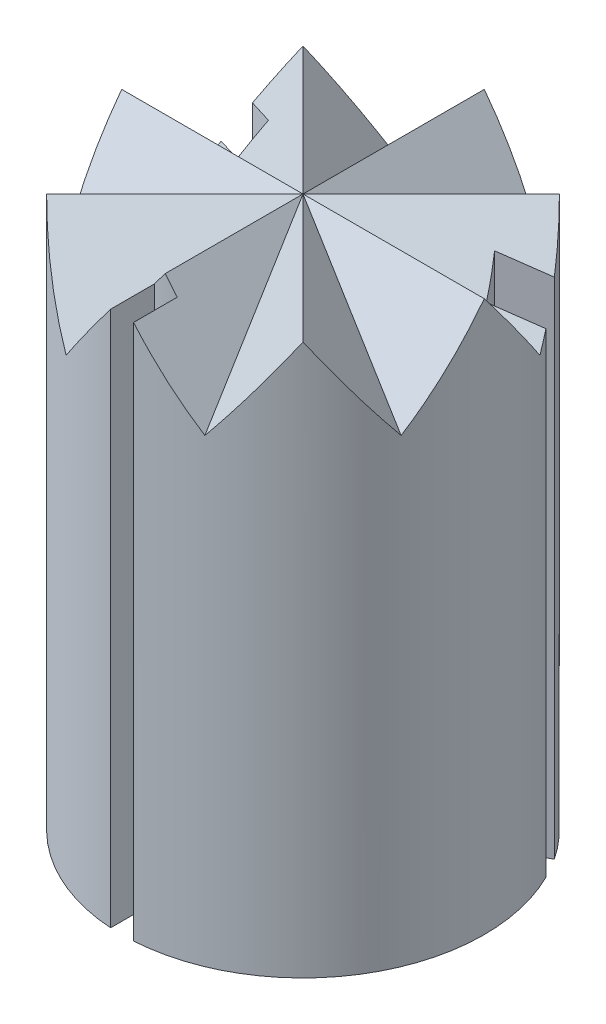
ISO-10303-21;
HEADER;
FILE_DESCRIPTION(('STEP AP214'),'2;1');
FILE_NAME('part.step','',(''),(''),'','','');
FILE_SCHEMA(('AUTOMOTIVE_DESIGN { 1 0 10303 214 1 1 1 1 }'));
ENDSEC;
DATA;
#1=APPLICATION_CONTEXT('core data for automotive mechanical design processes');
#2=APPLICATION_PROTOCOL_DEFINITION('international standard','automotive_design',2000,#1);
#3=PRODUCT_CONTEXT('',#1,'mechanical');
#4=PRODUCT('Part','Part','',(#3));
#5=PRODUCT_RELATED_PRODUCT_CATEGORY('part','',(#4));
#6=PRODUCT_DEFINITION_FORMATION('','',#4);
#7=PRODUCT_DEFINITION_CONTEXT('part definition',#1,'design');
#8=PRODUCT_DEFINITION('design','',#6,#7);
#9=PRODUCT_DEFINITION_SHAPE('','',#8);
#10=(LENGTH_UNIT() NAMED_UNIT(*) SI_UNIT(.MILLI.,.METRE.));
#11=(NAMED_UNIT(*) PLANE_ANGLE_UNIT() SI_UNIT($,.RADIAN.));
#12=(NAMED_UNIT(*) SI_UNIT($,.STERADIAN.) SOLID_ANGLE_UNIT());
#13=UNCERTAINTY_MEASURE_WITH_UNIT(LENGTH_MEASURE(1.E-05),#10,'distance_accuracy_value','');
#14=(GEOMETRIC_REPRESENTATION_CONTEXT(3) GLOBAL_UNCERTAINTY_ASSIGNED_CONTEXT((#13)) GLOBAL_UNIT_ASSIGNED_CONTEXT((#10,
#11,#12)) REPRESENTATION_CONTEXT('',''));
#15=CARTESIAN_POINT('',(0.,0.,0.));
#16=DIRECTION('',(0.,0.,1.));
#17=DIRECTION('',(1.,0.,0.));
#18=AXIS2_PLACEMENT_3D('',#15,#16,#17);
#19=CARTESIAN_POINT('',(-3.86113462226621,-2.95518450014505,0.));
#20=DIRECTION('',(-0.794104487760817,-0.607781262065664,0.));
#21=DIRECTION('',(0.607781262065664,-0.794104487760817,0.));
#22=AXIS2_PLACEMENT_3D('',#19,#20,#21);
#23=PLANE('',#22);
#24=DIRECTION('',(0.342282467452514,-0.447213595499957,0.826342975086386));
#25=VECTOR('',#24,1.);
#26=CARTESIAN_POINT('',(1.53073372946036,-10.,3.69551813004515));
#27=LINE('',#26,#25);
#28=CARTESIAN_POINT('',(0.,-8.,0.));
#29=VERTEX_POINT('',#28);
#30=CARTESIAN_POINT('',(1.51159955784211,-9.975,3.64932415341958));
#31=VERTEX_POINT('',#30);
#32=EDGE_CURVE('E398',#29,#31,#27,.T.);
#33=ORIENTED_EDGE('',*,*,#32,.F.);
#34=DIRECTION('',(0.,0.,1.));
#35=VECTOR('',#34,1.);
#36=CARTESIAN_POINT('',(0.,-8.,0.));
#37=LINE('',#36,#35);
#38=CARTESIAN_POINT('',(0.,-8.,3.));
#39=VERTEX_POINT('',#38);
#40=EDGE_CURVE('E63',#29,#39,#37,.T.);
#41=ORIENTED_EDGE('',*,*,#40,.T.);
#42=CARTESIAN_POINT('',(0.,-8.,0.));
#43=DIRECTION('',(-0.794104487760817,-0.607781262065664,0.));
#44=DIRECTION('',(0.607781262065664,-0.794104487760817,0.));
#45=AXIS2_PLACEMENT_3D('',#42,#43,#44);
#46=ELLIPSE('',#45,4.93598632804821,3.);
#47=CARTESIAN_POINT('',(0.25,-8.32664074121909,2.98956518577535));
#48=VERTEX_POINT('',#47);
#49=EDGE_CURVE('E71',#39,#48,#46,.F.);
#50=ORIENTED_EDGE('',*,*,#49,.T.);
#51=DIRECTION('',(0.,0.,-1.));
#52=VECTOR('',#51,1.);
#53=CARTESIAN_POINT('',(0.250000000000001,-8.32664074121909,0.));
#54=LINE('',#53,#52);
#55=CARTESIAN_POINT('',(0.25,-8.32664074121909,3.94208066888541));
#56=VERTEX_POINT('',#55);
#57=EDGE_CURVE('E265',#56,#48,#54,.T.);
#58=ORIENTED_EDGE('',*,*,#57,.F.);
#59=CARTESIAN_POINT('',(0.,-8.,0.));
#60=DIRECTION('',(-0.794104487760817,-0.607781262065664,0.));
#61=DIRECTION('',(-0.607781262065664,0.794104487760817,0.));
#62=AXIS2_PLACEMENT_3D('',#59,#60,#61);
#63=ELLIPSE('',#62,6.49904866526347,3.95);
#64=EDGE_CURVE('E200',#31,#56,#63,.T.);
#65=ORIENTED_EDGE('',*,*,#64,.F.);
#66=EDGE_LOOP('',(#33,#41,#50,#58,#65));
#67=FACE_BOUND('',#66,.T.);
#68=ADVANCED_FACE('F50',(#67),#23,.F.);
#69=CARTESIAN_POINT('',(3.86113462226621,-2.95518450014503,0.));
#70=DIRECTION('',(0.794104487760818,-0.607781262065662,0.));
#71=DIRECTION('',(0.607781262065662,0.794104487760818,0.));
#72=AXIS2_PLACEMENT_3D('',#69,#70,#71);
#73=PLANE('',#72);
#74=DIRECTION('',(0.,0.,1.));
#75=VECTOR('',#74,1.);
#76=CARTESIAN_POINT('',(-0.250000000000001,-8.3266407412191,0.));
#77=LINE('',#76,#75);
#78=CARTESIAN_POINT('',(-0.25,-8.32664074121909,2.98956518577535));
#79=VERTEX_POINT('',#78);
#80=CARTESIAN_POINT('',(-0.249999999999996,-8.32664074121909,3.94208066888541));
#81=VERTEX_POINT('',#80);
#82=EDGE_CURVE('E295',#79,#81,#77,.T.);
#83=ORIENTED_EDGE('',*,*,#82,.F.);
#84=CARTESIAN_POINT('',(0.,-8.,0.));
#85=DIRECTION('',(0.794104487760818,-0.607781262065662,0.));
#86=DIRECTION('',(-0.607781262065662,-0.794104487760818,0.));
#87=AXIS2_PLACEMENT_3D('',#84,#85,#86);
#88=ELLIPSE('',#87,4.93598632804822,3.);
#89=EDGE_CURVE('E409',#79,#39,#88,.F.);
#90=ORIENTED_EDGE('',*,*,#89,.T.);
#91=ORIENTED_EDGE('',*,*,#40,.F.);
#92=DIRECTION('',(-0.342282467452514,-0.447213595499957,0.826342975086386));
#93=VECTOR('',#92,1.);
#94=CARTESIAN_POINT('',(-1.53073372946035,-10.,3.69551813004515));
#95=LINE('',#94,#93);
#96=CARTESIAN_POINT('',(-1.5115995578421,-9.975,3.64932415341959));
#97=VERTEX_POINT('',#96);
#98=EDGE_CURVE('E387',#29,#97,#95,.T.);
#99=ORIENTED_EDGE('',*,*,#98,.T.);
#100=CARTESIAN_POINT('',(0.,-8.,0.));
#101=DIRECTION('',(0.794104487760818,-0.607781262065662,0.));
#102=DIRECTION('',(0.607781262065662,0.794104487760818,0.));
#103=AXIS2_PLACEMENT_3D('',#100,#101,#102);
#104=ELLIPSE('',#103,6.49904866526349,3.95);
#105=EDGE_CURVE('E338',#81,#97,#104,.T.);
#106=ORIENTED_EDGE('',*,*,#105,.F.);
#107=EDGE_LOOP('',(#83,#90,#91,#99,#106));
#108=FACE_BOUND('',#107,.T.);
#109=ADVANCED_FACE('F496',(#108),#73,.F.);
#110=CARTESIAN_POINT('',(-2.73023447447859,-2.95518450014503,-2.73023447447859));
#111=DIRECTION('',(-0.561516668266344,-0.607781262065662,-0.561516668266344));
#112=DIRECTION('',(0.,0.678598344545848,-0.734509555267755));
#113=AXIS2_PLACEMENT_3D('',#110,#111,#112);
#114=PLANE('',#113);
#115=DIRECTION('',(0.820387343691517,-0.320342746259435,-0.473650853720059));
#116=VECTOR('',#115,1.);
#117=CARTESIAN_POINT('',(-2.06035891672398,-7.46217738193782,1.47822390979265));
#118=LINE('',#117,#116);
#119=CARTESIAN_POINT('',(2.714039397151,-9.32647219263182,-1.27827624194156));
#120=VERTEX_POINT('',#119);
#121=CARTESIAN_POINT('',(3.53894200302231,-9.64857804688882,-1.75453398349659));
#122=VERTEX_POINT('',#121);
#123=EDGE_CURVE('E296',#120,#122,#118,.T.);
#124=ORIENTED_EDGE('',*,*,#123,.F.);
#125=CARTESIAN_POINT('',(0.,-8.,0.));
#126=DIRECTION('',(-0.561516668266344,-0.607781262065662,-0.561516668266344));
#127=DIRECTION('',(0.429766251884748,-0.794104487760818,0.429766251884748));
#128=AXIS2_PLACEMENT_3D('',#125,#126,#127);
#129=ELLIPSE('',#128,4.93598632804822,3.);
#130=CARTESIAN_POINT('',(2.464039397151,-8.69545073690837,-1.71128894383378));
#131=VERTEX_POINT('',#130);
#132=EDGE_CURVE('E414',#120,#131,#129,.F.);
#133=ORIENTED_EDGE('',*,*,#132,.T.);
#134=DIRECTION('',(-0.820387343691517,0.320342746259435,0.473650853720059));
#135=VECTOR('',#134,1.);
#136=CARTESIAN_POINT('',(-2.14452323807,-6.89591101676558,0.949465934188309));
#137=LINE('',#136,#135);
#138=CARTESIAN_POINT('',(3.28894200302231,-9.01755659116536,-2.18754668538881));
#139=VERTEX_POINT('',#138);
#140=EDGE_CURVE('E297',#139,#131,#137,.T.);
#141=ORIENTED_EDGE('',*,*,#140,.F.);
#142=CARTESIAN_POINT('',(0.,-8.,0.));
#143=DIRECTION('',(-0.561516668266344,-0.607781262065662,-0.561516668266344));
#144=DIRECTION('',(-0.429766251884748,0.794104487760818,-0.429766251884748));
#145=AXIS2_PLACEMENT_3D('',#142,#143,#144);
#146=ELLIPSE('',#145,6.49904866526349,3.95);
#147=CARTESIAN_POINT('',(2.79307178568686,-8.,-2.79307178568687));
#148=VERTEX_POINT('',#147);
#149=EDGE_CURVE('E310',#148,#139,#146,.T.);
#150=ORIENTED_EDGE('',*,*,#149,.F.);
#151=DIRECTION('',(-0.707106781186547,0.,0.707106781186548));
#152=VECTOR('',#151,1.);
#153=CARTESIAN_POINT('',(2.82842712474619,-8.,-2.82842712474619));
#154=LINE('',#153,#152);
#155=EDGE_CURVE('E382',#148,#29,#154,.T.);
#156=ORIENTED_EDGE('',*,*,#155,.T.);
#157=DIRECTION('',(-0.826342975086386,0.447213595499958,0.342282467452514));
#158=VECTOR('',#157,1.);
#159=CARTESIAN_POINT('',(3.69551813004515,-10.,-1.53073372946036));
#160=LINE('',#159,#158);
#161=CARTESIAN_POINT('',(3.64932415341958,-9.975,-1.51159955784211));
#162=VERTEX_POINT('',#161);
#163=EDGE_CURVE('E386',#162,#29,#160,.T.);
#164=ORIENTED_EDGE('',*,*,#163,.F.);
#165=CARTESIAN_POINT('',(0.,-8.,0.));
#166=DIRECTION('',(-0.561516668266344,-0.607781262065662,-0.561516668266344));
#167=DIRECTION('',(-0.429766251884748,0.794104487760818,-0.429766251884748));
#168=AXIS2_PLACEMENT_3D('',#165,#166,#167);
#169=ELLIPSE('',#168,6.49904866526349,3.95);
#170=EDGE_CURVE('E333',#122,#162,#169,.T.);
#171=ORIENTED_EDGE('',*,*,#170,.F.);
#172=EDGE_LOOP('',(#124,#133,#141,#150,#156,#164,#171));
#173=FACE_BOUND('',#172,.T.);
#174=ADVANCED_FACE('F461',(#173),#114,.F.);
#175=CARTESIAN_POINT('',(2.7302344744786,-2.95518450014506,-2.7302344744786));
#176=DIRECTION('',(0.561516668266343,-0.607781262065665,-0.561516668266343));
#177=DIRECTION('',(0.,0.678598344545845,-0.734509555267758));
#178=AXIS2_PLACEMENT_3D('',#175,#176,#177);
#179=PLANE('',#178);
#180=DIRECTION('',(-0.820387343691517,-0.320342746259432,-0.47365085372006));
#181=VECTOR('',#180,1.);
#182=CARTESIAN_POINT('',(2.14452323806998,-6.8959110167656,0.9494659341883));
#183=LINE('',#182,#181);
#184=CARTESIAN_POINT('',(-2.464039397151,-8.69545073690836,-1.71128894383379));
#185=VERTEX_POINT('',#184);
#186=CARTESIAN_POINT('',(-3.28894200302231,-9.01755659116535,-2.18754668538881));
#187=VERTEX_POINT('',#186);
#188=EDGE_CURVE('E304',#185,#187,#183,.T.);
#189=ORIENTED_EDGE('',*,*,#188,.F.);
#190=CARTESIAN_POINT('',(0.,-8.,0.));
#191=DIRECTION('',(0.561516668266343,-0.607781262065665,-0.561516668266343));
#192=DIRECTION('',(-0.42976625188475,-0.794104487760816,0.42976625188475));
#193=AXIS2_PLACEMENT_3D('',#190,#191,#192);
#194=ELLIPSE('',#193,4.9359863280482,3.);
#195=CARTESIAN_POINT('',(-2.714039397151,-9.32647219263181,-1.27827624194157));
#196=VERTEX_POINT('',#195);
#197=EDGE_CURVE('E420',#185,#196,#194,.F.);
#198=ORIENTED_EDGE('',*,*,#197,.T.);
#199=DIRECTION('',(0.820387343691517,0.320342746259432,0.47365085372006));
#200=VECTOR('',#199,1.);
#201=CARTESIAN_POINT('',(2.06035891672396,-7.46217738193784,1.47822390979264));
#202=LINE('',#201,#200);
#203=CARTESIAN_POINT('',(-3.53894200302231,-9.6485780468888,-1.7545339834966));
#204=VERTEX_POINT('',#203);
#205=EDGE_CURVE('E298',#204,#196,#202,.T.);
#206=ORIENTED_EDGE('',*,*,#205,.F.);
#207=CARTESIAN_POINT('',(0.,-8.,0.));
#208=DIRECTION('',(0.561516668266343,-0.607781262065665,-0.561516668266343));
#209=DIRECTION('',(0.42976625188475,0.794104487760816,-0.42976625188475));
#210=AXIS2_PLACEMENT_3D('',#207,#208,#209);
#211=ELLIPSE('',#210,6.49904866526346,3.95);
#212=CARTESIAN_POINT('',(-3.64932415341959,-9.975,-1.5115995578421));
#213=VERTEX_POINT('',#212);
#214=EDGE_CURVE('E348',#213,#204,#211,.T.);
#215=ORIENTED_EDGE('',*,*,#214,.F.);
#216=DIRECTION('',(-0.826342975086387,-0.447213595499957,-0.342282467452512));
#217=VECTOR('',#216,1.);
#218=CARTESIAN_POINT('',(-3.69551813004516,-10.,-1.53073372946035));
#219=LINE('',#218,#217);
#220=EDGE_CURVE('E352',#29,#213,#219,.T.);
#221=ORIENTED_EDGE('',*,*,#220,.F.);
#222=DIRECTION('',(0.707106781186548,0.,0.707106781186547));
#223=VECTOR('',#222,1.);
#224=CARTESIAN_POINT('',(-2.82842712474619,-8.,-2.82842712474619));
#225=LINE('',#224,#223);
#226=CARTESIAN_POINT('',(-2.79307178568686,-8.,-2.79307178568686));
#227=VERTEX_POINT('',#226);
#228=EDGE_CURVE('E353',#227,#29,#225,.T.);
#229=ORIENTED_EDGE('',*,*,#228,.F.);
#230=CARTESIAN_POINT('',(0.,-8.,0.));
#231=DIRECTION('',(0.561516668266343,-0.607781262065665,-0.561516668266343));
#232=DIRECTION('',(0.42976625188475,0.794104487760816,-0.42976625188475));
#233=AXIS2_PLACEMENT_3D('',#230,#231,#232);
#234=ELLIPSE('',#233,6.49904866526346,3.95);
#235=EDGE_CURVE('E51',#187,#227,#234,.T.);
#236=ORIENTED_EDGE('',*,*,#235,.F.);
#237=EDGE_LOOP('',(#189,#198,#206,#215,#221,#229,#236));
#238=FACE_BOUND('',#237,.T.);
#239=ADVANCED_FACE('F507',(#238),#179,.F.);
#240=CARTESIAN_POINT('',(2.7302344744786,-2.95518450014505,2.7302344744786));
#241=DIRECTION('',(0.561516668266343,-0.607781262065664,0.561516668266343));
#242=DIRECTION('',(0.,-0.678598344545846,-0.734509555267757));
#243=AXIS2_PLACEMENT_3D('',#240,#241,#242);
#244=PLANE('',#243);
#245=DIRECTION('',(-0.342282467452512,0.447213595499958,0.826342975086386));
#246=VECTOR('',#245,1.);
#247=CARTESIAN_POINT('',(1.53073372946035,-10.,-3.69551813004515));
#248=LINE('',#247,#246);
#249=CARTESIAN_POINT('',(1.5115995578421,-9.975,-3.64932415341958));
#250=VERTEX_POINT('',#249);
#251=EDGE_CURVE('E374',#250,#29,#248,.T.);
#252=ORIENTED_EDGE('',*,*,#251,.T.);
#253=ORIENTED_EDGE('',*,*,#155,.F.);
#254=CARTESIAN_POINT('',(0.,-8.,0.));
#255=DIRECTION('',(0.561516668266343,-0.607781262065664,0.561516668266343));
#256=DIRECTION('',(0.429766251884749,0.794104487760817,0.429766251884749));
#257=AXIS2_PLACEMENT_3D('',#254,#255,#256);
#258=ELLIPSE('',#257,6.49904866526347,3.95);
#259=EDGE_CURVE('E303',#250,#148,#258,.T.);
#260=ORIENTED_EDGE('',*,*,#259,.F.);
#261=EDGE_LOOP('',(#252,#253,#260));
#262=FACE_BOUND('',#261,.T.);
#263=ADVANCED_FACE('F469',(#262),#244,.F.);
#264=CARTESIAN_POINT('',(-3.86113462226621,-2.95518450014502,0.));
#265=DIRECTION('',(-0.794104487760819,-0.607781262065661,0.));
#266=DIRECTION('',(0.607781262065661,-0.794104487760819,0.));
#267=AXIS2_PLACEMENT_3D('',#264,#265,#266);
#268=PLANE('',#267);
#269=DIRECTION('',(0.,0.,1.));
#270=VECTOR('',#269,1.);
#271=CARTESIAN_POINT('',(0.,-8.,0.));
#272=LINE('',#271,#270);
#273=CARTESIAN_POINT('',(0.,-8.,-3.95));
#274=VERTEX_POINT('',#273);
#275=EDGE_CURVE('E370',#274,#29,#272,.T.);
#276=ORIENTED_EDGE('',*,*,#275,.T.);
#277=ORIENTED_EDGE('',*,*,#251,.F.);
#278=CARTESIAN_POINT('',(0.,-8.,0.));
#279=DIRECTION('',(-0.794104487760819,-0.607781262065661,0.));
#280=DIRECTION('',(-0.607781262065661,0.794104487760819,0.));
#281=AXIS2_PLACEMENT_3D('',#278,#279,#280);
#282=ELLIPSE('',#281,6.4990486652635,3.95);
#283=EDGE_CURVE('E306',#274,#250,#282,.T.);
#284=ORIENTED_EDGE('',*,*,#283,.F.);
#285=EDGE_LOOP('',(#276,#277,#284));
#286=FACE_BOUND('',#285,.T.);
#287=ADVANCED_FACE('F473',(#286),#268,.F.);
#288=CARTESIAN_POINT('',(3.86113462226621,-2.95518450014504,0.));
#289=DIRECTION('',(0.794104487760817,-0.607781262065663,0.));
#290=DIRECTION('',(0.607781262065663,0.794104487760817,0.));
#291=AXIS2_PLACEMENT_3D('',#288,#289,#290);
#292=PLANE('',#291);
#293=DIRECTION('',(0.342282467452514,0.447213595499958,0.826342975086385));
#294=VECTOR('',#293,1.);
#295=CARTESIAN_POINT('',(-1.53073372946036,-10.,-3.69551813004515));
#296=LINE('',#295,#294);
#297=CARTESIAN_POINT('',(-1.51159955784211,-9.975,-3.64932415341958));
#298=VERTEX_POINT('',#297);
#299=EDGE_CURVE('E358',#298,#29,#296,.T.);
#300=ORIENTED_EDGE('',*,*,#299,.T.);
#301=ORIENTED_EDGE('',*,*,#275,.F.);
#302=CARTESIAN_POINT('',(0.,-8.,0.));
#303=DIRECTION('',(0.794104487760817,-0.607781262065663,0.));
#304=DIRECTION('',(0.607781262065663,0.794104487760817,0.));
#305=AXIS2_PLACEMENT_3D('',#302,#303,#304);
#306=ELLIPSE('',#305,6.49904866526348,3.95);
#307=EDGE_CURVE('E311',#298,#274,#306,.T.);
#308=ORIENTED_EDGE('',*,*,#307,.F.);
#309=EDGE_LOOP('',(#300,#301,#308));
#310=FACE_BOUND('',#309,.T.);
#311=ADVANCED_FACE('F475',(#310),#292,.F.);
#312=CARTESIAN_POINT('',(-2.73023447447859,-2.95518450014503,2.73023447447859));
#313=DIRECTION('',(-0.561516668266344,-0.607781262065662,0.561516668266344));
#314=DIRECTION('',(0.,-0.678598344545848,-0.734509555267755));
#315=AXIS2_PLACEMENT_3D('',#312,#313,#314);
#316=PLANE('',#315);
#317=ORIENTED_EDGE('',*,*,#228,.T.);
#318=ORIENTED_EDGE('',*,*,#299,.F.);
#319=CARTESIAN_POINT('',(0.,-8.,0.));
#320=DIRECTION('',(-0.561516668266344,-0.607781262065662,0.561516668266344));
#321=DIRECTION('',(-0.429766251884747,0.794104487760818,0.429766251884748));
#322=AXIS2_PLACEMENT_3D('',#319,#320,#321);
#323=ELLIPSE('',#322,6.49904866526349,3.95);
#324=EDGE_CURVE('E320',#227,#298,#323,.T.);
#325=ORIENTED_EDGE('',*,*,#324,.F.);
#326=EDGE_LOOP('',(#317,#318,#325));
#327=FACE_BOUND('',#326,.T.);
#328=ADVANCED_FACE('F476',(#327),#316,.F.);
#329=CARTESIAN_POINT('',(-2.7302344744786,-2.95518450014505,2.7302344744786));
#330=DIRECTION('',(-0.561516668266343,-0.607781262065664,0.561516668266343));
#331=DIRECTION('',(0.734509555267757,-0.678598344545846,0.));
#332=AXIS2_PLACEMENT_3D('',#329,#330,#331);
#333=PLANE('',#332);
#334=DIRECTION('',(-0.826342975086386,0.447213595499958,-0.342282467452513));
#335=VECTOR('',#334,1.);
#336=CARTESIAN_POINT('',(3.69551813004515,-10.,1.53073372946036));
#337=LINE('',#336,#335);
#338=CARTESIAN_POINT('',(3.64932415341958,-9.975,1.5115995578421));
#339=VERTEX_POINT('',#338);
#340=EDGE_CURVE('E60',#339,#29,#337,.T.);
#341=ORIENTED_EDGE('',*,*,#340,.T.);
#342=DIRECTION('',(0.707106781186547,0.,0.707106781186548));
#343=VECTOR('',#342,1.);
#344=CARTESIAN_POINT('',(2.82842712474619,-8.,2.8284271247462));
#345=LINE('',#344,#343);
#346=CARTESIAN_POINT('',(2.79307178568686,-8.,2.79307178568687));
#347=VERTEX_POINT('',#346);
#348=EDGE_CURVE('E11',#29,#347,#345,.T.);
#349=ORIENTED_EDGE('',*,*,#348,.T.);
#350=CARTESIAN_POINT('',(0.,-8.,0.));
#351=DIRECTION('',(-0.561516668266343,-0.607781262065664,0.561516668266343));
#352=DIRECTION('',(-0.429766251884749,0.794104487760816,0.429766251884749));
#353=AXIS2_PLACEMENT_3D('',#350,#351,#352);
#354=ELLIPSE('',#353,6.49904866526347,3.95);
#355=EDGE_CURVE('E321',#339,#347,#354,.T.);
#356=ORIENTED_EDGE('',*,*,#355,.F.);
#357=EDGE_LOOP('',(#341,#349,#356));
#358=FACE_BOUND('',#357,.T.);
#359=ADVANCED_FACE('F47',(#358),#333,.F.);
#360=CARTESIAN_POINT('',(2.73023447447859,-2.95518450014503,-2.73023447447859));
#361=DIRECTION('',(0.561516668266344,-0.607781262065662,-0.561516668266344));
#362=DIRECTION('',(0.734509555267755,0.678598344545848,0.));
#363=AXIS2_PLACEMENT_3D('',#360,#361,#362);
#364=PLANE('',#363);
#365=ORIENTED_EDGE('',*,*,#348,.F.);
#366=ORIENTED_EDGE('',*,*,#32,.T.);
#367=CARTESIAN_POINT('',(0.,-8.,0.));
#368=DIRECTION('',(0.561516668266344,-0.607781262065662,-0.561516668266344));
#369=DIRECTION('',(0.429766251884748,0.794104487760818,-0.429766251884747));
#370=AXIS2_PLACEMENT_3D('',#367,#368,#369);
#371=ELLIPSE('',#370,6.4990486652635,3.95);
#372=EDGE_CURVE('E322',#347,#31,#371,.T.);
#373=ORIENTED_EDGE('',*,*,#372,.F.);
#374=EDGE_LOOP('',(#365,#366,#373));
#375=FACE_BOUND('',#374,.T.);
#376=ADVANCED_FACE('F482',(#375),#364,.F.);
#377=CARTESIAN_POINT('',(0.,-2.95518450014503,-3.86113462226621));
#378=DIRECTION('',(0.,-0.607781262065662,-0.794104487760818));
#379=DIRECTION('',(0.,0.794104487760818,-0.607781262065662));
#380=AXIS2_PLACEMENT_3D('',#377,#378,#379);
#381=PLANE('',#380);
#382=DIRECTION('',(-1.,0.,0.));
#383=VECTOR('',#382,1.);
#384=CARTESIAN_POINT('',(0.,-8.,0.));
#385=LINE('',#384,#383);
#386=CARTESIAN_POINT('',(3.95,-8.,0.));
#387=VERTEX_POINT('',#386);
#388=EDGE_CURVE('E393',#387,#29,#385,.T.);
#389=ORIENTED_EDGE('',*,*,#388,.T.);
#390=ORIENTED_EDGE('',*,*,#340,.F.);
#391=CARTESIAN_POINT('',(0.,-8.,0.));
#392=DIRECTION('',(0.,-0.607781262065662,-0.794104487760818));
#393=DIRECTION('',(0.,0.794104487760818,-0.607781262065662));
#394=AXIS2_PLACEMENT_3D('',#391,#392,#393);
#395=ELLIPSE('',#394,6.49904866526349,3.95);
#396=EDGE_CURVE('E330',#387,#339,#395,.T.);
#397=ORIENTED_EDGE('',*,*,#396,.F.);
#398=EDGE_LOOP('',(#389,#390,#397));
#399=FACE_BOUND('',#398,.T.);
#400=ADVANCED_FACE('F488',(#399),#381,.F.);
#401=CARTESIAN_POINT('',(0.,-2.95518450014504,3.86113462226621));
#402=DIRECTION('',(0.,-0.607781262065663,0.794104487760817));
#403=DIRECTION('',(0.,-0.794104487760817,-0.607781262065663));
#404=AXIS2_PLACEMENT_3D('',#401,#402,#403);
#405=PLANE('',#404);
#406=ORIENTED_EDGE('',*,*,#163,.T.);
#407=ORIENTED_EDGE('',*,*,#388,.F.);
#408=CARTESIAN_POINT('',(0.,-8.,0.));
#409=DIRECTION('',(0.,-0.607781262065663,0.794104487760817));
#410=DIRECTION('',(0.,0.794104487760817,0.607781262065663));
#411=AXIS2_PLACEMENT_3D('',#408,#409,#410);
#412=ELLIPSE('',#411,6.49904866526348,3.95);
#413=EDGE_CURVE('E332',#162,#387,#412,.T.);
#414=ORIENTED_EDGE('',*,*,#413,.F.);
#415=EDGE_LOOP('',(#406,#407,#414));
#416=FACE_BOUND('',#415,.T.);
#417=ADVANCED_FACE('F465',(#416),#405,.F.);
#418=CARTESIAN_POINT('',(-2.7302344744786,-2.95518450014504,-2.73023447447859));
#419=DIRECTION('',(-0.561516668266344,-0.607781262065663,-0.561516668266343));
#420=DIRECTION('',(0.734509555267756,-0.678598344545847,0.));
#421=AXIS2_PLACEMENT_3D('',#418,#419,#420);
#422=PLANE('',#421);
#423=ORIENTED_EDGE('',*,*,#98,.F.);
#424=DIRECTION('',(-0.707106781186546,0.,0.707106781186549));
#425=VECTOR('',#424,1.);
#426=CARTESIAN_POINT('',(-2.82842712474619,-8.,2.8284271247462));
#427=LINE('',#426,#425);
#428=CARTESIAN_POINT('',(-2.79307178568686,-8.,2.79307178568687));
#429=VERTEX_POINT('',#428);
#430=EDGE_CURVE('E377',#29,#429,#427,.T.);
#431=ORIENTED_EDGE('',*,*,#430,.T.);
#432=CARTESIAN_POINT('',(0.,-8.,0.));
#433=DIRECTION('',(-0.561516668266344,-0.607781262065663,-0.561516668266343));
#434=DIRECTION('',(-0.429766251884749,0.794104487760817,-0.429766251884748));
#435=AXIS2_PLACEMENT_3D('',#432,#433,#434);
#436=ELLIPSE('',#435,6.49904866526348,3.95);
#437=EDGE_CURVE('E337',#97,#429,#436,.T.);
#438=ORIENTED_EDGE('',*,*,#437,.F.);
#439=EDGE_LOOP('',(#423,#431,#438));
#440=FACE_BOUND('',#439,.T.);
#441=ADVANCED_FACE('F494',(#440),#422,.F.);
#442=CARTESIAN_POINT('',(2.7302344744786,-2.95518450014503,2.73023447447859));
#443=DIRECTION('',(0.561516668266345,-0.607781262065661,0.561516668266344));
#444=DIRECTION('',(0.734509555267754,0.678598344545848,0.));
#445=AXIS2_PLACEMENT_3D('',#442,#443,#444);
#446=PLANE('',#445);
#447=ORIENTED_EDGE('',*,*,#430,.F.);
#448=DIRECTION('',(-0.826342975086385,-0.447213595499957,0.342282467452516));
#449=VECTOR('',#448,1.);
#450=CARTESIAN_POINT('',(-3.69551813004515,-10.,1.53073372946037));
#451=LINE('',#450,#449);
#452=CARTESIAN_POINT('',(-3.64932415341958,-9.975,1.51159955784211));
#453=VERTEX_POINT('',#452);
#454=EDGE_CURVE('E371',#29,#453,#451,.T.);
#455=ORIENTED_EDGE('',*,*,#454,.T.);
#456=CARTESIAN_POINT('',(0.,-8.,0.));
#457=DIRECTION('',(0.561516668266345,-0.607781262065661,0.561516668266344));
#458=DIRECTION('',(0.429766251884748,0.794104487760818,0.429766251884747));
#459=AXIS2_PLACEMENT_3D('',#456,#457,#458);
#460=ELLIPSE('',#459,6.4990486652635,3.95);
#461=EDGE_CURVE('E336',#429,#453,#460,.T.);
#462=ORIENTED_EDGE('',*,*,#461,.F.);
#463=EDGE_LOOP('',(#447,#455,#462));
#464=FACE_BOUND('',#463,.T.);
#465=ADVANCED_FACE('F510',(#464),#446,.F.);
#466=CARTESIAN_POINT('',(0.,-2.95518450014506,-3.86113462226622));
#467=DIRECTION('',(0.,-0.607781262065665,-0.794104487760816));
#468=DIRECTION('',(0.,0.794104487760816,-0.607781262065665));
#469=AXIS2_PLACEMENT_3D('',#466,#467,#468);
#470=PLANE('',#469);
#471=ORIENTED_EDGE('',*,*,#454,.F.);
#472=DIRECTION('',(-1.,0.,0.));
#473=VECTOR('',#472,1.);
#474=CARTESIAN_POINT('',(0.,-8.,0.));
#475=LINE('',#474,#473);
#476=CARTESIAN_POINT('',(-3.95,-8.,0.));
#477=VERTEX_POINT('',#476);
#478=EDGE_CURVE('E361',#29,#477,#475,.T.);
#479=ORIENTED_EDGE('',*,*,#478,.T.);
#480=CARTESIAN_POINT('',(0.,-8.,0.));
#481=DIRECTION('',(0.,-0.607781262065665,-0.794104487760816));
#482=DIRECTION('',(0.,0.794104487760816,-0.607781262065665));
#483=AXIS2_PLACEMENT_3D('',#480,#481,#482);
#484=ELLIPSE('',#483,6.49904866526346,3.95);
#485=EDGE_CURVE('E344',#453,#477,#484,.T.);
#486=ORIENTED_EDGE('',*,*,#485,.F.);
#487=EDGE_LOOP('',(#471,#479,#486));
#488=FACE_BOUND('',#487,.T.);
#489=ADVANCED_FACE('F517',(#488),#470,.F.);
#490=CARTESIAN_POINT('',(0.,-2.95518450014502,3.8611346222662));
#491=DIRECTION('',(0.,-0.607781262065661,0.794104487760819));
#492=DIRECTION('',(0.,-0.794104487760819,-0.607781262065661));
#493=AXIS2_PLACEMENT_3D('',#490,#491,#492);
#494=PLANE('',#493);
#495=ORIENTED_EDGE('',*,*,#478,.F.);
#496=ORIENTED_EDGE('',*,*,#220,.T.);
#497=CARTESIAN_POINT('',(0.,-8.,0.));
#498=DIRECTION('',(0.,-0.607781262065661,0.794104487760819));
#499=DIRECTION('',(0.,0.794104487760819,0.607781262065661));
#500=AXIS2_PLACEMENT_3D('',#497,#498,#499);
#501=ELLIPSE('',#500,6.4990486652635,3.95);
#502=EDGE_CURVE('E347',#477,#213,#501,.T.);
#503=ORIENTED_EDGE('',*,*,#502,.F.);
#504=EDGE_LOOP('',(#495,#496,#503));
#505=FACE_BOUND('',#504,.T.);
#506=ADVANCED_FACE('F522',(#505),#494,.F.);
#507=CARTESIAN_POINT('',(0.,0.,0.));
#508=DIRECTION('',(0.,-1.,0.));
#509=DIRECTION('',(0.,0.,-1.));
#510=AXIS2_PLACEMENT_3D('',#507,#508,#509);
#511=CYLINDRICAL_SURFACE('',#510,3.);
#512=ORIENTED_EDGE('',*,*,#197,.F.);
#513=DIRECTION('',(0.,-1.,0.));
#514=VECTOR('',#513,1.);
#515=CARTESIAN_POINT('',(-2.464039397151,0.,-1.71128894383379));
#516=LINE('',#515,#514);
#517=CARTESIAN_POINT('',(-2.464039397151,-20.,-1.71128894383378));
#518=VERTEX_POINT('',#517);
#519=EDGE_CURVE('E272',#185,#518,#516,.T.);
#520=ORIENTED_EDGE('',*,*,#519,.T.);
#521=CARTESIAN_POINT('',(0.,-20.,0.));
#522=DIRECTION('',(0.,-1.,0.));
#523=DIRECTION('',(0.,0.,-1.));
#524=AXIS2_PLACEMENT_3D('',#521,#522,#523);
#525=CIRCLE('',#524,3.);
#526=CARTESIAN_POINT('',(-2.714039397151,-20.,-1.27827624194157));
#527=VERTEX_POINT('',#526);
#528=EDGE_CURVE('E240',#527,#518,#525,.T.);
#529=ORIENTED_EDGE('',*,*,#528,.F.);
#530=DIRECTION('',(0.,-1.,0.));
#531=VECTOR('',#530,1.);
#532=CARTESIAN_POINT('',(-2.714039397151,0.,-1.27827624194157));
#533=LINE('',#532,#531);
#534=EDGE_CURVE('E256',#196,#527,#533,.T.);
#535=ORIENTED_EDGE('',*,*,#534,.F.);
#536=EDGE_LOOP('',(#512,#520,#529,#535));
#537=FACE_BOUND('',#536,.T.);
#538=ADVANCED_FACE('F526',(#537),#511,.T.);
#539=CARTESIAN_POINT('',(0.,-10.,0.));
#540=DIRECTION('',(0.,1.,0.));
#541=DIRECTION('',(0.,0.,1.));
#542=AXIS2_PLACEMENT_3D('',#539,#540,#541);
#543=CYLINDRICAL_SURFACE('',#542,3.95);
#544=ORIENTED_EDGE('',*,*,#502,.T.);
#545=ORIENTED_EDGE('',*,*,#214,.T.);
#546=DIRECTION('',(0.,-1.,0.));
#547=VECTOR('',#546,1.);
#548=CARTESIAN_POINT('',(-3.53894200302231,0.,-1.75453398349659));
#549=LINE('',#548,#547);
#550=CARTESIAN_POINT('',(-3.53894200302231,-20.,-1.75453398349659));
#551=VERTEX_POINT('',#550);
#552=EDGE_CURVE('E279',#204,#551,#549,.T.);
#553=ORIENTED_EDGE('',*,*,#552,.T.);
#554=CARTESIAN_POINT('',(0.,-20.,0.));
#555=DIRECTION('',(0.,-1.,0.));
#556=DIRECTION('',(0.,0.,-1.));
#557=AXIS2_PLACEMENT_3D('',#554,#555,#556);
#558=CIRCLE('',#557,3.95);
#559=CARTESIAN_POINT('',(-0.249999999999998,-20.,3.94208066888541));
#560=VERTEX_POINT('',#559);
#561=EDGE_CURVE('E226',#560,#551,#558,.T.);
#562=ORIENTED_EDGE('',*,*,#561,.F.);
#563=DIRECTION('',(0.,-1.,0.));
#564=VECTOR('',#563,1.);
#565=CARTESIAN_POINT('',(-0.249999999999996,0.,3.94208066888541));
#566=LINE('',#565,#564);
#567=EDGE_CURVE('E201',#81,#560,#566,.T.);
#568=ORIENTED_EDGE('',*,*,#567,.F.);
#569=ORIENTED_EDGE('',*,*,#105,.T.);
#570=ORIENTED_EDGE('',*,*,#437,.T.);
#571=ORIENTED_EDGE('',*,*,#461,.T.);
#572=ORIENTED_EDGE('',*,*,#485,.T.);
#573=EDGE_LOOP('',(#544,#545,#553,#562,#568,#569,#570,#571,#572));
#574=FACE_BOUND('',#573,.T.);
#575=ADVANCED_FACE('F536',(#574),#543,.T.);
#576=CARTESIAN_POINT('',(0.,0.,0.));
#577=DIRECTION('',(0.,-1.,0.));
#578=DIRECTION('',(0.,0.,-1.));
#579=AXIS2_PLACEMENT_3D('',#576,#577,#578);
#580=CYLINDRICAL_SURFACE('',#579,3.);
#581=ORIENTED_EDGE('',*,*,#89,.F.);
#582=DIRECTION('',(0.,-1.,0.));
#583=VECTOR('',#582,1.);
#584=CARTESIAN_POINT('',(-0.25,0.,2.98956518577535));
#585=LINE('',#584,#583);
#586=CARTESIAN_POINT('',(-0.25,-20.,2.98956518577535));
#587=VERTEX_POINT('',#586);
#588=EDGE_CURVE('E259',#79,#587,#585,.T.);
#589=ORIENTED_EDGE('',*,*,#588,.T.);
#590=CARTESIAN_POINT('',(0.,-20.,0.));
#591=DIRECTION('',(0.,-1.,0.));
#592=DIRECTION('',(0.,0.,-1.));
#593=AXIS2_PLACEMENT_3D('',#590,#591,#592);
#594=CIRCLE('',#593,3.);
#595=CARTESIAN_POINT('',(0.25,-20.,2.98956518577535));
#596=VERTEX_POINT('',#595);
#597=EDGE_CURVE('E213',#596,#587,#594,.T.);
#598=ORIENTED_EDGE('',*,*,#597,.F.);
#599=DIRECTION('',(0.,-1.,0.));
#600=VECTOR('',#599,1.);
#601=CARTESIAN_POINT('',(0.25,0.,2.98956518577535));
#602=LINE('',#601,#600);
#603=EDGE_CURVE('E204',#48,#596,#602,.T.);
#604=ORIENTED_EDGE('',*,*,#603,.F.);
#605=ORIENTED_EDGE('',*,*,#49,.F.);
#606=EDGE_LOOP('',(#581,#589,#598,#604,#605));
#607=FACE_BOUND('',#606,.T.);
#608=ADVANCED_FACE('F554',(#607),#580,.T.);
#609=DIRECTION('',(0.,-1.,0.));
#610=VECTOR('',#609,1.);
#611=CARTESIAN_POINT('',(3.53894200302231,0.,-1.75453398349659));
#612=LINE('',#611,#610);
#613=CARTESIAN_POINT('',(3.53894200302231,-20.,-1.75453398349659));
#614=VERTEX_POINT('',#613);
#615=EDGE_CURVE('E268',#122,#614,#612,.T.);
#616=ORIENTED_EDGE('',*,*,#615,.F.);
#617=ORIENTED_EDGE('',*,*,#170,.T.);
#618=ORIENTED_EDGE('',*,*,#413,.T.);
#619=ORIENTED_EDGE('',*,*,#396,.T.);
#620=ORIENTED_EDGE('',*,*,#355,.T.);
#621=ORIENTED_EDGE('',*,*,#372,.T.);
#622=ORIENTED_EDGE('',*,*,#64,.T.);
#623=DIRECTION('',(0.,-1.,0.));
#624=VECTOR('',#623,1.);
#625=CARTESIAN_POINT('',(0.25,0.,3.94208066888541));
#626=LINE('',#625,#624);
#627=CARTESIAN_POINT('',(0.25,-20.,3.94208066888541));
#628=VERTEX_POINT('',#627);
#629=EDGE_CURVE('E192',#56,#628,#626,.T.);
#630=ORIENTED_EDGE('',*,*,#629,.T.);
#631=CARTESIAN_POINT('',(0.,-20.,0.));
#632=DIRECTION('',(0.,-1.,0.));
#633=DIRECTION('',(0.,0.,-1.));
#634=AXIS2_PLACEMENT_3D('',#631,#632,#633);
#635=CIRCLE('',#634,3.95);
#636=EDGE_CURVE('E197',#614,#628,#635,.T.);
#637=ORIENTED_EDGE('',*,*,#636,.F.);
#638=EDGE_LOOP('',(#616,#617,#618,#619,#620,#621,#622,#630,#637));
#639=FACE_BOUND('',#638,.T.);
#640=ADVANCED_FACE('F195',(#639),#543,.T.);
#641=CARTESIAN_POINT('',(0.250000000000001,0.,0.));
#642=DIRECTION('',(1.,0.,0.));
#643=DIRECTION('',(0.,0.,-1.));
#644=AXIS2_PLACEMENT_3D('',#641,#642,#643);
#645=PLANE('',#644);
#646=ORIENTED_EDGE('',*,*,#629,.F.);
#647=ORIENTED_EDGE('',*,*,#57,.T.);
#648=ORIENTED_EDGE('',*,*,#603,.T.);
#649=DIRECTION('',(0.,0.,-1.));
#650=VECTOR('',#649,1.);
#651=CARTESIAN_POINT('',(0.25,-20.,3.94208066888541));
#652=LINE('',#651,#650);
#653=EDGE_CURVE('E210',#628,#596,#652,.T.);
#654=ORIENTED_EDGE('',*,*,#653,.F.);
#655=EDGE_LOOP('',(#646,#647,#648,#654));
#656=FACE_BOUND('',#655,.T.);
#657=ADVANCED_FACE('F208',(#656),#645,.F.);
#658=CARTESIAN_POINT('',(-0.250000000000001,0.,0.));
#659=DIRECTION('',(-1.,0.,0.));
#660=DIRECTION('',(0.,0.,1.));
#661=AXIS2_PLACEMENT_3D('',#658,#659,#660);
#662=PLANE('',#661);
#663=ORIENTED_EDGE('',*,*,#588,.F.);
#664=ORIENTED_EDGE('',*,*,#82,.T.);
#665=ORIENTED_EDGE('',*,*,#567,.T.);
#666=DIRECTION('',(0.,0.,1.));
#667=VECTOR('',#666,1.);
#668=CARTESIAN_POINT('',(-0.250000000000001,-20.,2.98956518577535));
#669=LINE('',#668,#667);
#670=EDGE_CURVE('E223',#587,#560,#669,.T.);
#671=ORIENTED_EDGE('',*,*,#670,.F.);
#672=EDGE_LOOP('',(#663,#664,#665,#671));
#673=FACE_BOUND('',#672,.T.);
#674=ADVANCED_FACE('F547',(#673),#662,.F.);
#675=CARTESIAN_POINT('',(0.,0.,0.));
#676=DIRECTION('',(0.,-1.,0.));
#677=DIRECTION('',(0.,0.,-1.));
#678=AXIS2_PLACEMENT_3D('',#675,#676,#677);
#679=CYLINDRICAL_SURFACE('',#678,3.);
#680=ORIENTED_EDGE('',*,*,#132,.F.);
#681=DIRECTION('',(0.,-1.,0.));
#682=VECTOR('',#681,1.);
#683=CARTESIAN_POINT('',(2.714039397151,0.,-1.27827624194156));
#684=LINE('',#683,#682);
#685=CARTESIAN_POINT('',(2.714039397151,-20.,-1.27827624194157));
#686=VERTEX_POINT('',#685);
#687=EDGE_CURVE('E264',#120,#686,#684,.T.);
#688=ORIENTED_EDGE('',*,*,#687,.T.);
#689=CARTESIAN_POINT('',(0.,-20.,0.));
#690=DIRECTION('',(0.,-1.,0.));
#691=DIRECTION('',(0.,0.,-1.));
#692=AXIS2_PLACEMENT_3D('',#689,#690,#691);
#693=CIRCLE('',#692,3.);
#694=CARTESIAN_POINT('',(2.464039397151,-20.,-1.71128894383378));
#695=VERTEX_POINT('',#694);
#696=EDGE_CURVE('E251',#695,#686,#693,.T.);
#697=ORIENTED_EDGE('',*,*,#696,.F.);
#698=DIRECTION('',(0.,-1.,0.));
#699=VECTOR('',#698,1.);
#700=CARTESIAN_POINT('',(2.464039397151,0.,-1.71128894383378));
#701=LINE('',#700,#699);
#702=EDGE_CURVE('E267',#131,#695,#701,.T.);
#703=ORIENTED_EDGE('',*,*,#702,.F.);
#704=EDGE_LOOP('',(#680,#688,#697,#703));
#705=FACE_BOUND('',#704,.T.);
#706=ADVANCED_FACE('F452',(#705),#679,.T.);
#707=DIRECTION('',(0.,-1.,0.));
#708=VECTOR('',#707,1.);
#709=CARTESIAN_POINT('',(-3.28894200302231,0.,-2.18754668538881));
#710=LINE('',#709,#708);
#711=CARTESIAN_POINT('',(-3.28894200302231,-20.,-2.18754668538881));
#712=VERTEX_POINT('',#711);
#713=EDGE_CURVE('E277',#187,#712,#710,.T.);
#714=ORIENTED_EDGE('',*,*,#713,.F.);
#715=ORIENTED_EDGE('',*,*,#235,.T.);
#716=ORIENTED_EDGE('',*,*,#324,.T.);
#717=ORIENTED_EDGE('',*,*,#307,.T.);
#718=ORIENTED_EDGE('',*,*,#283,.T.);
#719=ORIENTED_EDGE('',*,*,#259,.T.);
#720=ORIENTED_EDGE('',*,*,#149,.T.);
#721=DIRECTION('',(0.,-1.,0.));
#722=VECTOR('',#721,1.);
#723=CARTESIAN_POINT('',(3.28894200302231,0.,-2.18754668538881));
#724=LINE('',#723,#722);
#725=CARTESIAN_POINT('',(3.28894200302231,-20.,-2.18754668538881));
#726=VERTEX_POINT('',#725);
#727=EDGE_CURVE('E275',#139,#726,#724,.T.);
#728=ORIENTED_EDGE('',*,*,#727,.T.);
#729=CARTESIAN_POINT('',(0.,-20.,0.));
#730=DIRECTION('',(0.,-1.,0.));
#731=DIRECTION('',(0.,0.,-1.));
#732=AXIS2_PLACEMENT_3D('',#729,#730,#731);
#733=CIRCLE('',#732,3.95);
#734=EDGE_CURVE('E243',#712,#726,#733,.T.);
#735=ORIENTED_EDGE('',*,*,#734,.F.);
#736=EDGE_LOOP('',(#714,#715,#716,#717,#718,#719,#720,#728,#735));
#737=FACE_BOUND('',#736,.T.);
#738=ADVANCED_FACE('F445',(#737),#543,.T.);
#739=CARTESIAN_POINT('',(-0.125,0.,-0.216506350946109));
#740=DIRECTION('',(-0.5,0.,-0.866025403784439));
#741=DIRECTION('',(-0.866025403784439,0.,0.5));
#742=AXIS2_PLACEMENT_3D('',#739,#740,#741);
#743=PLANE('',#742);
#744=ORIENTED_EDGE('',*,*,#727,.F.);
#745=ORIENTED_EDGE('',*,*,#140,.T.);
#746=ORIENTED_EDGE('',*,*,#702,.T.);
#747=DIRECTION('',(-0.866025403784439,0.,0.499999999999999));
#748=VECTOR('',#747,1.);
#749=CARTESIAN_POINT('',(3.28894200302231,-20.,-2.18754668538881));
#750=LINE('',#749,#748);
#751=EDGE_CURVE('E248',#726,#695,#750,.T.);
#752=ORIENTED_EDGE('',*,*,#751,.F.);
#753=EDGE_LOOP('',(#744,#745,#746,#752));
#754=FACE_BOUND('',#753,.T.);
#755=ADVANCED_FACE('F449',(#754),#743,.F.);
#756=CARTESIAN_POINT('',(0.125,0.,0.216506350946109));
#757=DIRECTION('',(0.5,0.,0.866025403784439));
#758=DIRECTION('',(0.866025403784439,0.,-0.5));
#759=AXIS2_PLACEMENT_3D('',#756,#757,#758);
#760=PLANE('',#759);
#761=ORIENTED_EDGE('',*,*,#687,.F.);
#762=ORIENTED_EDGE('',*,*,#123,.T.);
#763=ORIENTED_EDGE('',*,*,#615,.T.);
#764=DIRECTION('',(0.866025403784439,0.,-0.499999999999999));
#765=VECTOR('',#764,1.);
#766=CARTESIAN_POINT('',(2.714039397151,-20.,-1.27827624194157));
#767=LINE('',#766,#765);
#768=EDGE_CURVE('E218',#686,#614,#767,.T.);
#769=ORIENTED_EDGE('',*,*,#768,.F.);
#770=EDGE_LOOP('',(#761,#762,#763,#769));
#771=FACE_BOUND('',#770,.T.);
#772=ADVANCED_FACE('F457',(#771),#760,.F.);
#773=CARTESIAN_POINT('',(-0.125,0.,0.216506350946109));
#774=DIRECTION('',(-0.5,0.,0.866025403784438));
#775=DIRECTION('',(0.866025403784438,0.,0.5));
#776=AXIS2_PLACEMENT_3D('',#773,#774,#775);
#777=PLANE('',#776);
#778=ORIENTED_EDGE('',*,*,#552,.F.);
#779=ORIENTED_EDGE('',*,*,#205,.T.);
#780=ORIENTED_EDGE('',*,*,#534,.T.);
#781=DIRECTION('',(0.866025403784439,0.,0.5));
#782=VECTOR('',#781,1.);
#783=CARTESIAN_POINT('',(-3.53894200302231,-20.,-1.75453398349659));
#784=LINE('',#783,#782);
#785=EDGE_CURVE('E234',#551,#527,#784,.T.);
#786=ORIENTED_EDGE('',*,*,#785,.F.);
#787=EDGE_LOOP('',(#778,#779,#780,#786));
#788=FACE_BOUND('',#787,.T.);
#789=ADVANCED_FACE('F539',(#788),#777,.F.);
#790=CARTESIAN_POINT('',(0.125,0.,-0.216506350946109));
#791=DIRECTION('',(0.500000000000001,0.,-0.866025403784438));
#792=DIRECTION('',(-0.866025403784438,0.,-0.500000000000001));
#793=AXIS2_PLACEMENT_3D('',#790,#791,#792);
#794=PLANE('',#793);
#795=ORIENTED_EDGE('',*,*,#519,.F.);
#796=ORIENTED_EDGE('',*,*,#188,.T.);
#797=ORIENTED_EDGE('',*,*,#713,.T.);
#798=DIRECTION('',(-0.866025403784438,0.,-0.500000000000001));
#799=VECTOR('',#798,1.);
#800=CARTESIAN_POINT('',(-2.464039397151,-20.,-1.71128894383379));
#801=LINE('',#800,#799);
#802=EDGE_CURVE('E242',#518,#712,#801,.T.);
#803=ORIENTED_EDGE('',*,*,#802,.F.);
#804=EDGE_LOOP('',(#795,#796,#797,#803));
#805=FACE_BOUND('',#804,.T.);
#806=ADVANCED_FACE('F440',(#805),#794,.F.);
#807=CARTESIAN_POINT('',(0.,-20.,0.));
#808=DIRECTION('',(0.,-1.,0.));
#809=DIRECTION('',(0.,0.,-1.));
#810=AXIS2_PLACEMENT_3D('',#807,#808,#809);
#811=PLANE('',#810);
#812=ORIENTED_EDGE('',*,*,#636,.T.);
#813=ORIENTED_EDGE('',*,*,#653,.T.);
#814=ORIENTED_EDGE('',*,*,#597,.T.);
#815=ORIENTED_EDGE('',*,*,#670,.T.);
#816=ORIENTED_EDGE('',*,*,#561,.T.);
#817=ORIENTED_EDGE('',*,*,#785,.T.);
#818=ORIENTED_EDGE('',*,*,#528,.T.);
#819=ORIENTED_EDGE('',*,*,#802,.T.);
#820=ORIENTED_EDGE('',*,*,#734,.T.);
#821=ORIENTED_EDGE('',*,*,#751,.T.);
#822=ORIENTED_EDGE('',*,*,#696,.T.);
#823=ORIENTED_EDGE('',*,*,#768,.T.);
#824=EDGE_LOOP('',(#812,#813,#814,#815,#816,#817,#818,#819,#820,#821,#822,#823));
#825=FACE_BOUND('',#824,.T.);
#826=ADVANCED_FACE('F216',(#825),#811,.T.);
#827=CLOSED_SHELL('',(#68,#109,#174,#239,#263,#287,#311,#328,#359,#376,#400,#417,#441,#465,#489,
#506,#538,#575,#608,#640,#657,#674,#706,#738,#755,#772,#789,#806,#826));
#828=MANIFOLD_SOLID_BREP('B2',#827);
#829=ADVANCED_BREP_SHAPE_REPRESENTATION('',(#18,#828),#14);
#830=SHAPE_DEFINITION_REPRESENTATION(#9,#829);
ENDSEC;
END-ISO-10303-21;
